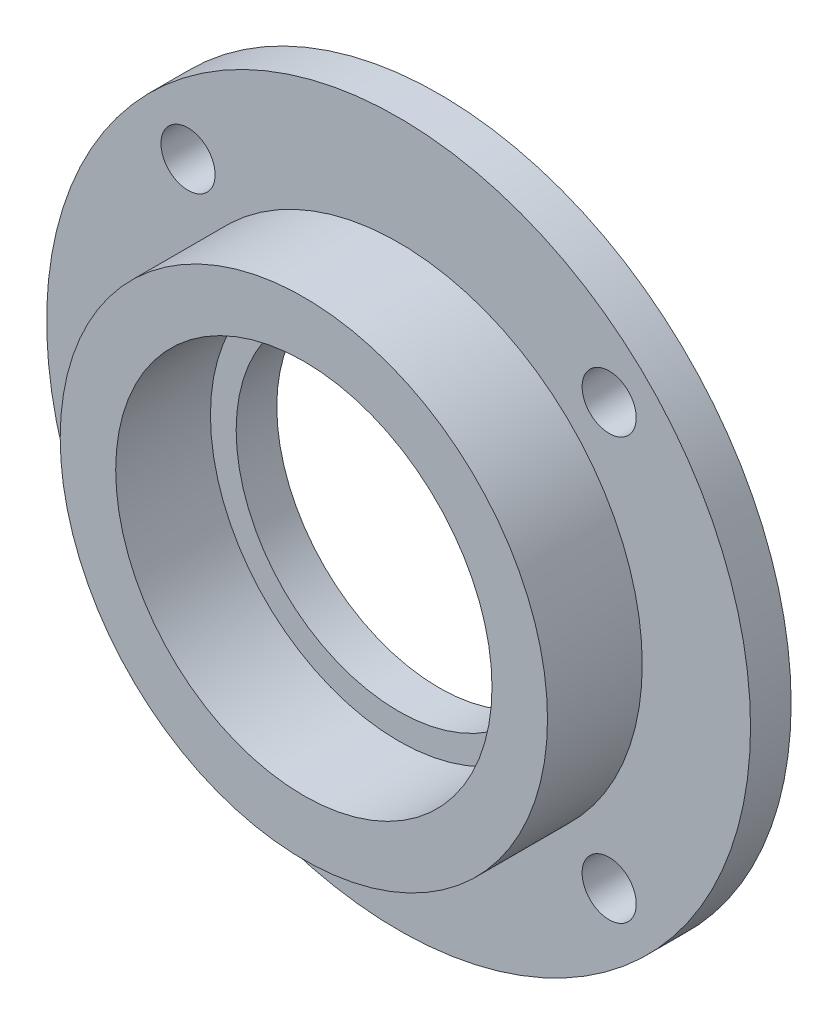
ISO-10303-21;
HEADER;
FILE_DESCRIPTION(('STEP AP214'),'2;1');
FILE_NAME('part.step','',(''),(''),'','','');
FILE_SCHEMA(('AUTOMOTIVE_DESIGN { 1 0 10303 214 1 1 1 1 }'));
ENDSEC;
DATA;
#1=APPLICATION_CONTEXT('core data for automotive mechanical design processes');
#2=APPLICATION_PROTOCOL_DEFINITION('international standard','automotive_design',2000,#1);
#3=PRODUCT_CONTEXT('',#1,'mechanical');
#4=PRODUCT('Part','Part','',(#3));
#5=PRODUCT_RELATED_PRODUCT_CATEGORY('part','',(#4));
#6=PRODUCT_DEFINITION_FORMATION('','',#4);
#7=PRODUCT_DEFINITION_CONTEXT('part definition',#1,'design');
#8=PRODUCT_DEFINITION('design','',#6,#7);
#9=PRODUCT_DEFINITION_SHAPE('','',#8);
#10=(LENGTH_UNIT() NAMED_UNIT(*) SI_UNIT(.MILLI.,.METRE.));
#11=(NAMED_UNIT(*) PLANE_ANGLE_UNIT() SI_UNIT($,.RADIAN.));
#12=(NAMED_UNIT(*) SI_UNIT($,.STERADIAN.) SOLID_ANGLE_UNIT());
#13=UNCERTAINTY_MEASURE_WITH_UNIT(LENGTH_MEASURE(1.E-05),#10,'distance_accuracy_value','');
#14=(GEOMETRIC_REPRESENTATION_CONTEXT(3) GLOBAL_UNCERTAINTY_ASSIGNED_CONTEXT((#13)) GLOBAL_UNIT_ASSIGNED_CONTEXT((#10,
#11,#12)) REPRESENTATION_CONTEXT('',''));
#15=CARTESIAN_POINT('',(0.,0.,0.));
#16=DIRECTION('',(0.,0.,1.));
#17=DIRECTION('',(1.,0.,0.));
#18=AXIS2_PLACEMENT_3D('',#15,#16,#17);
#19=CARTESIAN_POINT('',(0.,0.,3.));
#20=DIRECTION('',(0.,0.,1.));
#21=DIRECTION('',(1.,0.,0.));
#22=AXIS2_PLACEMENT_3D('',#19,#20,#21);
#23=PLANE('',#22);
#24=CARTESIAN_POINT('',(0.,0.,3.));
#25=DIRECTION('',(0.,0.,1.));
#26=DIRECTION('',(1.,0.,0.));
#27=AXIS2_PLACEMENT_3D('',#24,#25,#26);
#28=CIRCLE('',#27,12.);
#29=CARTESIAN_POINT('',(12.,0.,3.));
#30=VERTEX_POINT('',#29);
#31=EDGE_CURVE('E48',#30,#30,#28,.T.);
#32=ORIENTED_EDGE('',*,*,#31,.F.);
#33=EDGE_LOOP('',(#32));
#34=FACE_BOUND('',#33,.T.);
#35=CARTESIAN_POINT('',(0.,0.,3.));
#36=DIRECTION('',(0.,0.,1.));
#37=DIRECTION('',(1.,0.,0.));
#38=AXIS2_PLACEMENT_3D('',#35,#36,#37);
#39=CIRCLE('',#38,13.9);
#40=CARTESIAN_POINT('',(13.9,0.,3.));
#41=VERTEX_POINT('',#40);
#42=EDGE_CURVE('E10',#41,#41,#39,.F.);
#43=ORIENTED_EDGE('',*,*,#42,.F.);
#44=EDGE_LOOP('',(#43));
#45=FACE_BOUND('',#44,.T.);
#46=ADVANCED_FACE('F32',(#34,#45),#23,.T.);
#47=CARTESIAN_POINT('',(0.,0.,3.));
#48=DIRECTION('',(0.,0.,1.));
#49=DIRECTION('',(1.,0.,0.));
#50=AXIS2_PLACEMENT_3D('',#47,#48,#49);
#51=CIRCLE('',#50,18.);
#52=CARTESIAN_POINT('',(18.,0.,3.));
#53=VERTEX_POINT('',#52);
#54=EDGE_CURVE('E80',#53,#53,#51,.T.);
#55=ORIENTED_EDGE('',*,*,#54,.F.);
#56=EDGE_LOOP('',(#55));
#57=FACE_BOUND('',#56,.T.);
#58=CARTESIAN_POINT('',(15.5563491861048,-15.5563491861032,3.));
#59=DIRECTION('',(0.,0.,1.));
#60=DIRECTION('',(1.,0.,0.));
#61=AXIS2_PLACEMENT_3D('',#58,#59,#60);
#62=CIRCLE('',#61,2.00000000000103);
#63=CARTESIAN_POINT('',(17.5563491861059,-15.5563491861032,3.));
#64=VERTEX_POINT('',#63);
#65=EDGE_CURVE('E65',#64,#64,#62,.T.);
#66=ORIENTED_EDGE('',*,*,#65,.F.);
#67=EDGE_LOOP('',(#66));
#68=FACE_BOUND('',#67,.T.);
#69=CARTESIAN_POINT('',(-15.556349186104,15.556349186104,3.));
#70=DIRECTION('',(0.,0.,1.));
#71=DIRECTION('',(1.,0.,0.));
#72=AXIS2_PLACEMENT_3D('',#69,#70,#71);
#73=CIRCLE('',#72,2.00000000000103);
#74=CARTESIAN_POINT('',(-13.556349186103,15.556349186104,3.));
#75=VERTEX_POINT('',#74);
#76=EDGE_CURVE('E53',#75,#75,#73,.T.);
#77=ORIENTED_EDGE('',*,*,#76,.F.);
#78=EDGE_LOOP('',(#77));
#79=FACE_BOUND('',#78,.T.);
#80=CARTESIAN_POINT('',(0.,0.,3.));
#81=DIRECTION('',(0.,0.,1.));
#82=DIRECTION('',(1.,0.,0.));
#83=AXIS2_PLACEMENT_3D('',#80,#81,#82);
#84=CIRCLE('',#83,26.);
#85=CARTESIAN_POINT('',(26.,0.,3.));
#86=VERTEX_POINT('',#85);
#87=EDGE_CURVE('E39',#86,#86,#84,.T.);
#88=ORIENTED_EDGE('',*,*,#87,.T.);
#89=EDGE_LOOP('',(#88));
#90=FACE_BOUND('',#89,.T.);
#91=CARTESIAN_POINT('',(15.556349186104,15.5563491861048,3.));
#92=DIRECTION('',(0.,0.,1.));
#93=DIRECTION('',(1.,0.,0.));
#94=AXIS2_PLACEMENT_3D('',#91,#92,#93);
#95=CIRCLE('',#94,2.00000000000103);
#96=CARTESIAN_POINT('',(17.5563491861051,15.5563491861048,3.));
#97=VERTEX_POINT('',#96);
#98=EDGE_CURVE('E59',#97,#97,#95,.T.);
#99=ORIENTED_EDGE('',*,*,#98,.F.);
#100=EDGE_LOOP('',(#99));
#101=FACE_BOUND('',#100,.T.);
#102=CARTESIAN_POINT('',(-15.5563491861032,-15.556349186104,3.));
#103=DIRECTION('',(0.,0.,1.));
#104=DIRECTION('',(1.,0.,0.));
#105=AXIS2_PLACEMENT_3D('',#102,#103,#104);
#106=CIRCLE('',#105,2.00000000000103);
#107=CARTESIAN_POINT('',(-13.5563491861022,-15.556349186104,3.));
#108=VERTEX_POINT('',#107);
#109=EDGE_CURVE('E71',#108,#108,#106,.T.);
#110=ORIENTED_EDGE('',*,*,#109,.F.);
#111=EDGE_LOOP('',(#110));
#112=FACE_BOUND('',#111,.T.);
#113=ADVANCED_FACE('F108',(#57,#68,#79,#90,#101,#112),#23,.T.);
#114=CARTESIAN_POINT('',(0.,0.,0.));
#115=DIRECTION('',(0.,0.,1.));
#116=DIRECTION('',(1.,0.,0.));
#117=AXIS2_PLACEMENT_3D('',#114,#115,#116);
#118=PLANE('',#117);
#119=CARTESIAN_POINT('',(0.,0.,0.));
#120=DIRECTION('',(0.,0.,1.));
#121=DIRECTION('',(1.,0.,0.));
#122=AXIS2_PLACEMENT_3D('',#119,#120,#121);
#123=CIRCLE('',#122,26.);
#124=CARTESIAN_POINT('',(26.,0.,0.));
#125=VERTEX_POINT('',#124);
#126=EDGE_CURVE('E43',#125,#125,#123,.T.);
#127=ORIENTED_EDGE('',*,*,#126,.F.);
#128=EDGE_LOOP('',(#127));
#129=FACE_BOUND('',#128,.T.);
#130=CARTESIAN_POINT('',(0.,0.,0.));
#131=DIRECTION('',(0.,0.,1.));
#132=DIRECTION('',(1.,0.,0.));
#133=AXIS2_PLACEMENT_3D('',#130,#131,#132);
#134=CIRCLE('',#133,12.);
#135=CARTESIAN_POINT('',(12.,0.,0.));
#136=VERTEX_POINT('',#135);
#137=EDGE_CURVE('E50',#136,#136,#134,.T.);
#138=ORIENTED_EDGE('',*,*,#137,.T.);
#139=EDGE_LOOP('',(#138));
#140=FACE_BOUND('',#139,.T.);
#141=CARTESIAN_POINT('',(-15.556349186104,15.556349186104,0.));
#142=DIRECTION('',(0.,0.,1.));
#143=DIRECTION('',(1.,0.,0.));
#144=AXIS2_PLACEMENT_3D('',#141,#142,#143);
#145=CIRCLE('',#144,2.00000000000103);
#146=CARTESIAN_POINT('',(-13.556349186103,15.556349186104,0.));
#147=VERTEX_POINT('',#146);
#148=EDGE_CURVE('E56',#147,#147,#145,.T.);
#149=ORIENTED_EDGE('',*,*,#148,.T.);
#150=EDGE_LOOP('',(#149));
#151=FACE_BOUND('',#150,.T.);
#152=CARTESIAN_POINT('',(15.556349186104,15.5563491861048,0.));
#153=DIRECTION('',(0.,0.,1.));
#154=DIRECTION('',(1.,0.,0.));
#155=AXIS2_PLACEMENT_3D('',#152,#153,#154);
#156=CIRCLE('',#155,2.00000000000103);
#157=CARTESIAN_POINT('',(17.5563491861051,15.5563491861048,0.));
#158=VERTEX_POINT('',#157);
#159=EDGE_CURVE('E62',#158,#158,#156,.T.);
#160=ORIENTED_EDGE('',*,*,#159,.T.);
#161=EDGE_LOOP('',(#160));
#162=FACE_BOUND('',#161,.T.);
#163=CARTESIAN_POINT('',(15.5563491861048,-15.5563491861032,0.));
#164=DIRECTION('',(0.,0.,1.));
#165=DIRECTION('',(1.,0.,0.));
#166=AXIS2_PLACEMENT_3D('',#163,#164,#165);
#167=CIRCLE('',#166,2.00000000000103);
#168=CARTESIAN_POINT('',(17.5563491861059,-15.5563491861032,0.));
#169=VERTEX_POINT('',#168);
#170=EDGE_CURVE('E68',#169,#169,#167,.T.);
#171=ORIENTED_EDGE('',*,*,#170,.T.);
#172=EDGE_LOOP('',(#171));
#173=FACE_BOUND('',#172,.T.);
#174=CARTESIAN_POINT('',(-15.5563491861032,-15.556349186104,0.));
#175=DIRECTION('',(0.,0.,1.));
#176=DIRECTION('',(1.,0.,0.));
#177=AXIS2_PLACEMENT_3D('',#174,#175,#176);
#178=CIRCLE('',#177,2.00000000000103);
#179=CARTESIAN_POINT('',(-13.5563491861022,-15.556349186104,0.));
#180=VERTEX_POINT('',#179);
#181=EDGE_CURVE('E74',#180,#180,#178,.T.);
#182=ORIENTED_EDGE('',*,*,#181,.T.);
#183=EDGE_LOOP('',(#182));
#184=FACE_BOUND('',#183,.T.);
#185=ADVANCED_FACE('F114',(#129,#140,#151,#162,#173,#184),#118,.F.);
#186=CARTESIAN_POINT('',(0.,0.,3.));
#187=DIRECTION('',(0.,0.,-1.));
#188=DIRECTION('',(-1.,0.,0.));
#189=AXIS2_PLACEMENT_3D('',#186,#187,#188);
#190=CYLINDRICAL_SURFACE('',#189,26.);
#191=ORIENTED_EDGE('',*,*,#87,.F.);
#192=EDGE_LOOP('',(#191));
#193=FACE_BOUND('',#192,.T.);
#194=ORIENTED_EDGE('',*,*,#126,.T.);
#195=EDGE_LOOP('',(#194));
#196=FACE_BOUND('',#195,.T.);
#197=ADVANCED_FACE('F34',(#193,#196),#190,.T.);
#198=CARTESIAN_POINT('',(0.,0.,3.));
#199=DIRECTION('',(0.,0.,-1.));
#200=DIRECTION('',(-1.,0.,0.));
#201=AXIS2_PLACEMENT_3D('',#198,#199,#200);
#202=CYLINDRICAL_SURFACE('',#201,12.);
#203=ORIENTED_EDGE('',*,*,#31,.T.);
#204=EDGE_LOOP('',(#203));
#205=FACE_BOUND('',#204,.T.);
#206=ORIENTED_EDGE('',*,*,#137,.F.);
#207=EDGE_LOOP('',(#206));
#208=FACE_BOUND('',#207,.T.);
#209=ADVANCED_FACE('F119',(#205,#208),#202,.F.);
#210=CARTESIAN_POINT('',(-15.556349186104,15.556349186104,3.));
#211=DIRECTION('',(0.,0.,-1.));
#212=DIRECTION('',(-1.,0.,0.));
#213=AXIS2_PLACEMENT_3D('',#210,#211,#212);
#214=CYLINDRICAL_SURFACE('',#213,2.00000000000103);
#215=ORIENTED_EDGE('',*,*,#76,.T.);
#216=EDGE_LOOP('',(#215));
#217=FACE_BOUND('',#216,.T.);
#218=ORIENTED_EDGE('',*,*,#148,.F.);
#219=EDGE_LOOP('',(#218));
#220=FACE_BOUND('',#219,.T.);
#221=ADVANCED_FACE('F147',(#217,#220),#214,.F.);
#222=CARTESIAN_POINT('',(15.556349186104,15.5563491861048,3.));
#223=DIRECTION('',(0.,0.,-1.));
#224=DIRECTION('',(-1.,0.,0.));
#225=AXIS2_PLACEMENT_3D('',#222,#223,#224);
#226=CYLINDRICAL_SURFACE('',#225,2.00000000000103);
#227=ORIENTED_EDGE('',*,*,#98,.T.);
#228=EDGE_LOOP('',(#227));
#229=FACE_BOUND('',#228,.T.);
#230=ORIENTED_EDGE('',*,*,#159,.F.);
#231=EDGE_LOOP('',(#230));
#232=FACE_BOUND('',#231,.T.);
#233=ADVANCED_FACE('F141',(#229,#232),#226,.F.);
#234=CARTESIAN_POINT('',(15.5563491861048,-15.5563491861032,3.));
#235=DIRECTION('',(0.,0.,-1.));
#236=DIRECTION('',(-1.,0.,0.));
#237=AXIS2_PLACEMENT_3D('',#234,#235,#236);
#238=CYLINDRICAL_SURFACE('',#237,2.00000000000103);
#239=ORIENTED_EDGE('',*,*,#65,.T.);
#240=EDGE_LOOP('',(#239));
#241=FACE_BOUND('',#240,.T.);
#242=ORIENTED_EDGE('',*,*,#170,.F.);
#243=EDGE_LOOP('',(#242));
#244=FACE_BOUND('',#243,.T.);
#245=ADVANCED_FACE('F103',(#241,#244),#238,.F.);
#246=CARTESIAN_POINT('',(-15.5563491861032,-15.556349186104,3.));
#247=DIRECTION('',(0.,0.,-1.));
#248=DIRECTION('',(-1.,0.,0.));
#249=AXIS2_PLACEMENT_3D('',#246,#247,#248);
#250=CYLINDRICAL_SURFACE('',#249,2.00000000000103);
#251=ORIENTED_EDGE('',*,*,#109,.T.);
#252=EDGE_LOOP('',(#251));
#253=FACE_BOUND('',#252,.T.);
#254=ORIENTED_EDGE('',*,*,#181,.F.);
#255=EDGE_LOOP('',(#254));
#256=FACE_BOUND('',#255,.T.);
#257=ADVANCED_FACE('F94',(#253,#256),#250,.F.);
#258=CARTESIAN_POINT('',(0.,0.,10.));
#259=DIRECTION('',(0.,0.,1.));
#260=DIRECTION('',(1.,0.,0.));
#261=AXIS2_PLACEMENT_3D('',#258,#259,#260);
#262=PLANE('',#261);
#263=CARTESIAN_POINT('',(0.,0.,10.));
#264=DIRECTION('',(0.,0.,1.));
#265=DIRECTION('',(1.,0.,0.));
#266=AXIS2_PLACEMENT_3D('',#263,#264,#265);
#267=CIRCLE('',#266,18.);
#268=CARTESIAN_POINT('',(18.,0.,10.));
#269=VERTEX_POINT('',#268);
#270=EDGE_CURVE('E77',#269,#269,#267,.T.);
#271=ORIENTED_EDGE('',*,*,#270,.T.);
#272=EDGE_LOOP('',(#271));
#273=FACE_BOUND('',#272,.T.);
#274=CARTESIAN_POINT('',(0.,0.,10.));
#275=DIRECTION('',(0.,0.,1.));
#276=DIRECTION('',(1.,0.,0.));
#277=AXIS2_PLACEMENT_3D('',#274,#275,#276);
#278=CIRCLE('',#277,13.9);
#279=CARTESIAN_POINT('',(13.9,0.,10.));
#280=VERTEX_POINT('',#279);
#281=EDGE_CURVE('E83',#280,#280,#278,.T.);
#282=ORIENTED_EDGE('',*,*,#281,.F.);
#283=EDGE_LOOP('',(#282));
#284=FACE_BOUND('',#283,.T.);
#285=ADVANCED_FACE('F91',(#273,#284),#262,.T.);
#286=CARTESIAN_POINT('',(0.,0.,10.));
#287=DIRECTION('',(0.,0.,-1.));
#288=DIRECTION('',(-1.,0.,0.));
#289=AXIS2_PLACEMENT_3D('',#286,#287,#288);
#290=CYLINDRICAL_SURFACE('',#289,18.);
#291=ORIENTED_EDGE('',*,*,#270,.F.);
#292=EDGE_LOOP('',(#291));
#293=FACE_BOUND('',#292,.T.);
#294=ORIENTED_EDGE('',*,*,#54,.T.);
#295=EDGE_LOOP('',(#294));
#296=FACE_BOUND('',#295,.T.);
#297=ADVANCED_FACE('F93',(#293,#296),#290,.T.);
#298=CARTESIAN_POINT('',(0.,0.,10.));
#299=DIRECTION('',(0.,0.,-1.));
#300=DIRECTION('',(-1.,0.,0.));
#301=AXIS2_PLACEMENT_3D('',#298,#299,#300);
#302=CYLINDRICAL_SURFACE('',#301,13.9);
#303=ORIENTED_EDGE('',*,*,#281,.T.);
#304=EDGE_LOOP('',(#303));
#305=FACE_BOUND('',#304,.T.);
#306=ORIENTED_EDGE('',*,*,#42,.T.);
#307=EDGE_LOOP('',(#306));
#308=FACE_BOUND('',#307,.T.);
#309=ADVANCED_FACE('F89',(#305,#308),#302,.F.);
#310=CLOSED_SHELL('',(#46,#113,#185,#197,#209,#221,#233,#245,#257,#285,#297,#309));
#311=MANIFOLD_SOLID_BREP('B2',#310);
#312=ADVANCED_BREP_SHAPE_REPRESENTATION('',(#18,#311),#14);
#313=SHAPE_DEFINITION_REPRESENTATION(#9,#312);
ENDSEC;
END-ISO-10303-21;
